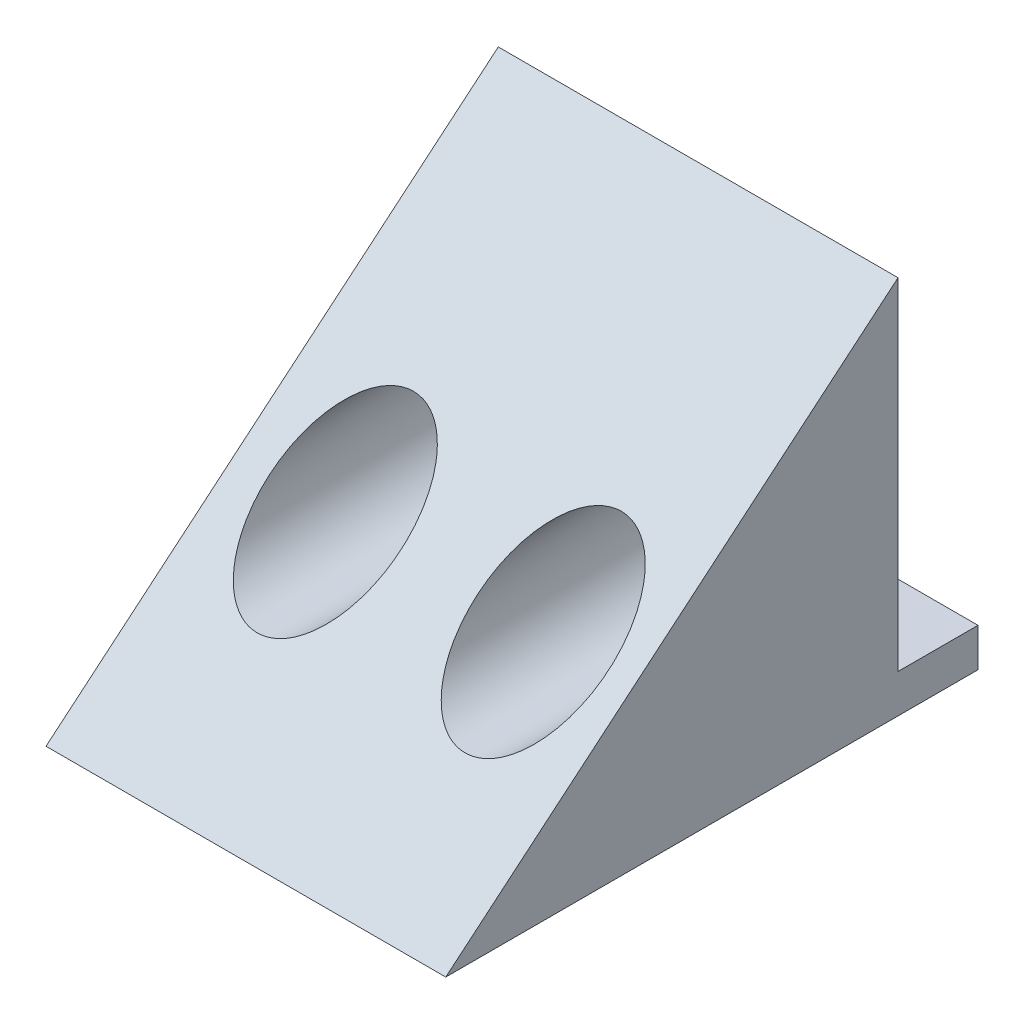
ISO-10303-21;
HEADER;
FILE_DESCRIPTION(('STEP AP214'),'2;1');
FILE_NAME('part.step','',(''),(''),'','','');
FILE_SCHEMA(('AUTOMOTIVE_DESIGN { 1 0 10303 214 1 1 1 1 }'));
ENDSEC;
DATA;
#1=APPLICATION_CONTEXT('core data for automotive mechanical design processes');
#2=APPLICATION_PROTOCOL_DEFINITION('international standard','automotive_design',2000,#1);
#3=PRODUCT_CONTEXT('',#1,'mechanical');
#4=PRODUCT('Part','Part','',(#3));
#5=PRODUCT_RELATED_PRODUCT_CATEGORY('part','',(#4));
#6=PRODUCT_DEFINITION_FORMATION('','',#4);
#7=PRODUCT_DEFINITION_CONTEXT('part definition',#1,'design');
#8=PRODUCT_DEFINITION('design','',#6,#7);
#9=PRODUCT_DEFINITION_SHAPE('','',#8);
#10=(LENGTH_UNIT() NAMED_UNIT(*) SI_UNIT(.MILLI.,.METRE.));
#11=(NAMED_UNIT(*) PLANE_ANGLE_UNIT() SI_UNIT($,.RADIAN.));
#12=(NAMED_UNIT(*) SI_UNIT($,.STERADIAN.) SOLID_ANGLE_UNIT());
#13=UNCERTAINTY_MEASURE_WITH_UNIT(LENGTH_MEASURE(1.E-05),#10,'distance_accuracy_value','');
#14=(GEOMETRIC_REPRESENTATION_CONTEXT(3) GLOBAL_UNCERTAINTY_ASSIGNED_CONTEXT((#13)) GLOBAL_UNIT_ASSIGNED_CONTEXT((#10,
#11,#12)) REPRESENTATION_CONTEXT('',''));
#15=CARTESIAN_POINT('',(0.,0.,0.));
#16=DIRECTION('',(0.,0.,1.));
#17=DIRECTION('',(1.,0.,0.));
#18=AXIS2_PLACEMENT_3D('',#15,#16,#17);
#19=CARTESIAN_POINT('',(50.,0.,-56.5672108573154));
#20=DIRECTION('',(0.,0.,1.));
#21=DIRECTION('',(1.,0.,0.));
#22=AXIS2_PLACEMENT_3D('',#19,#20,#21);
#23=PLANE('',#22);
#24=CARTESIAN_POINT('',(12.5544439751325,19.83,-56.5672108573154));
#25=DIRECTION('',(0.,0.,-1.));
#26=DIRECTION('',(-1.,0.,0.));
#27=AXIS2_PLACEMENT_3D('',#24,#25,#26);
#28=CIRCLE('',#27,8.2);
#29=CARTESIAN_POINT('',(4.35444397513247,19.83,-56.5672108573154));
#30=VERTEX_POINT('',#29);
#31=EDGE_CURVE('E104',#30,#30,#28,.T.);
#32=ORIENTED_EDGE('',*,*,#31,.F.);
#33=EDGE_LOOP('',(#32));
#34=FACE_BOUND('',#33,.T.);
#35=CARTESIAN_POINT('',(38.5544439751325,19.83,-56.5672108573154));
#36=DIRECTION('',(0.,0.,-1.));
#37=DIRECTION('',(-1.,0.,0.));
#38=AXIS2_PLACEMENT_3D('',#35,#36,#37);
#39=CIRCLE('',#38,8.2);
#40=CARTESIAN_POINT('',(30.3544439751325,19.83,-56.5672108573154));
#41=VERTEX_POINT('',#40);
#42=EDGE_CURVE('E103',#41,#41,#39,.T.);
#43=ORIENTED_EDGE('',*,*,#42,.F.);
#44=EDGE_LOOP('',(#43));
#45=FACE_BOUND('',#44,.T.);
#46=DIRECTION('',(1.,0.,0.));
#47=VECTOR('',#46,1.);
#48=CARTESIAN_POINT('',(50.,4.81865241578154,-56.5672108573154));
#49=LINE('',#48,#47);
#50=CARTESIAN_POINT('',(0.,4.81865241578154,-56.5672108573154));
#51=VERTEX_POINT('',#50);
#52=CARTESIAN_POINT('',(50.,4.81865241578154,-56.5672108573154));
#53=VERTEX_POINT('',#52);
#54=EDGE_CURVE('E54',#51,#53,#49,.T.);
#55=ORIENTED_EDGE('',*,*,#54,.F.);
#56=DIRECTION('',(0.,1.,0.));
#57=VECTOR('',#56,1.);
#58=CARTESIAN_POINT('',(0.,0.,-56.5672108573154));
#59=LINE('',#58,#57);
#60=CARTESIAN_POINT('',(0.,47.4655257671009,-56.5672108573154));
#61=VERTEX_POINT('',#60);
#62=EDGE_CURVE('E72',#51,#61,#59,.T.);
#63=ORIENTED_EDGE('',*,*,#62,.T.);
#64=DIRECTION('',(-1.,0.,0.));
#65=VECTOR('',#64,1.);
#66=CARTESIAN_POINT('',(50.,47.4655257671009,-56.5672108573154));
#67=LINE('',#66,#65);
#68=CARTESIAN_POINT('',(50.,47.4655257671009,-56.5672108573154));
#69=VERTEX_POINT('',#68);
#70=EDGE_CURVE('E47',#69,#61,#67,.T.);
#71=ORIENTED_EDGE('',*,*,#70,.F.);
#72=DIRECTION('',(0.,1.,0.));
#73=VECTOR('',#72,1.);
#74=CARTESIAN_POINT('',(50.,0.,-56.5672108573154));
#75=LINE('',#74,#73);
#76=EDGE_CURVE('E62',#53,#69,#75,.T.);
#77=ORIENTED_EDGE('',*,*,#76,.F.);
#78=EDGE_LOOP('',(#55,#63,#71,#77));
#79=FACE_BOUND('',#78,.T.);
#80=ADVANCED_FACE('F39',(#34,#45,#79),#23,.F.);
#81=CARTESIAN_POINT('',(50.,0.,0.));
#82=DIRECTION('',(0.,-0.766044443118977,-0.64278760968654));
#83=DIRECTION('',(0.,0.64278760968654,-0.766044443118977));
#84=AXIS2_PLACEMENT_3D('',#81,#82,#83);
#85=PLANE('',#84);
#86=CARTESIAN_POINT('',(38.5544439751325,19.83,-23.6324737411431));
#87=DIRECTION('',(0.,-0.766044443118977,-0.64278760968654));
#88=DIRECTION('',(0.,0.64278760968654,-0.766044443118977));
#89=AXIS2_PLACEMENT_3D('',#86,#87,#88);
#90=ELLIPSE('',#89,12.7569353802554,8.2);
#91=CARTESIAN_POINT('',(38.5544439751325,28.03,-33.4048532004156));
#92=VERTEX_POINT('',#91);
#93=EDGE_CURVE('E89',#92,#92,#90,.T.);
#94=ORIENTED_EDGE('',*,*,#93,.T.);
#95=EDGE_LOOP('',(#94));
#96=FACE_BOUND('',#95,.T.);
#97=CARTESIAN_POINT('',(12.5544439751325,19.83,-23.6324737411431));
#98=DIRECTION('',(0.,-0.766044443118977,-0.64278760968654));
#99=DIRECTION('',(0.,0.64278760968654,-0.766044443118977));
#100=AXIS2_PLACEMENT_3D('',#97,#98,#99);
#101=ELLIPSE('',#100,12.7569353802554,8.2);
#102=CARTESIAN_POINT('',(12.5544439751325,28.03,-33.4048532004156));
#103=VERTEX_POINT('',#102);
#104=EDGE_CURVE('E93',#103,#103,#101,.T.);
#105=ORIENTED_EDGE('',*,*,#104,.T.);
#106=EDGE_LOOP('',(#105));
#107=FACE_BOUND('',#106,.T.);
#108=DIRECTION('',(0.,-0.64278760968654,0.766044443118977));
#109=VECTOR('',#108,1.);
#110=CARTESIAN_POINT('',(0.,0.,0.));
#111=LINE('',#110,#109);
#112=CARTESIAN_POINT('',(0.,0.,0.));
#113=VERTEX_POINT('',#112);
#114=EDGE_CURVE('E85',#61,#113,#111,.T.);
#115=ORIENTED_EDGE('',*,*,#114,.T.);
#116=DIRECTION('',(-1.,0.,0.));
#117=VECTOR('',#116,1.);
#118=CARTESIAN_POINT('',(50.,0.,0.));
#119=LINE('',#118,#117);
#120=CARTESIAN_POINT('',(50.,0.,0.));
#121=VERTEX_POINT('',#120);
#122=EDGE_CURVE('E11',#121,#113,#119,.T.);
#123=ORIENTED_EDGE('',*,*,#122,.F.);
#124=DIRECTION('',(0.,-0.64278760968654,0.766044443118977));
#125=VECTOR('',#124,1.);
#126=CARTESIAN_POINT('',(50.,0.,0.));
#127=LINE('',#126,#125);
#128=EDGE_CURVE('E79',#69,#121,#127,.T.);
#129=ORIENTED_EDGE('',*,*,#128,.F.);
#130=ORIENTED_EDGE('',*,*,#70,.T.);
#131=EDGE_LOOP('',(#115,#123,#129,#130));
#132=FACE_BOUND('',#131,.T.);
#133=ADVANCED_FACE('F41',(#96,#107,#132),#85,.F.);
#134=CARTESIAN_POINT('',(50.,0.,0.));
#135=DIRECTION('',(0.,1.,0.));
#136=DIRECTION('',(0.,0.,1.));
#137=AXIS2_PLACEMENT_3D('',#134,#135,#136);
#138=PLANE('',#137);
#139=CARTESIAN_POINT('',(24.6819354769607,0.,-61.8784027442422));
#140=DIRECTION('',(0.,1.,0.));
#141=DIRECTION('',(0.,0.,1.));
#142=AXIS2_PLACEMENT_3D('',#139,#140,#141);
#143=CIRCLE('',#142,1.585);
#144=CARTESIAN_POINT('',(24.6819354769607,0.,-60.2934027442422));
#145=VERTEX_POINT('',#144);
#146=EDGE_CURVE('E116',#145,#145,#143,.T.);
#147=ORIENTED_EDGE('',*,*,#146,.T.);
#148=EDGE_LOOP('',(#147));
#149=FACE_BOUND('',#148,.T.);
#150=DIRECTION('',(0.,0.,-1.));
#151=VECTOR('',#150,1.);
#152=CARTESIAN_POINT('',(0.,0.,0.));
#153=LINE('',#152,#151);
#154=CARTESIAN_POINT('',(0.,0.,-66.5672108573154));
#155=VERTEX_POINT('',#154);
#156=EDGE_CURVE('E80',#113,#155,#153,.T.);
#157=ORIENTED_EDGE('',*,*,#156,.T.);
#158=DIRECTION('',(-1.,0.,0.));
#159=VECTOR('',#158,1.);
#160=CARTESIAN_POINT('',(50.,0.,-66.5672108573154));
#161=LINE('',#160,#159);
#162=CARTESIAN_POINT('',(50.,0.,-66.5672108573154));
#163=VERTEX_POINT('',#162);
#164=EDGE_CURVE('E122',#163,#155,#161,.T.);
#165=ORIENTED_EDGE('',*,*,#164,.F.);
#166=DIRECTION('',(0.,0.,-1.));
#167=VECTOR('',#166,1.);
#168=CARTESIAN_POINT('',(50.,0.,0.));
#169=LINE('',#168,#167);
#170=EDGE_CURVE('E97',#121,#163,#169,.T.);
#171=ORIENTED_EDGE('',*,*,#170,.F.);
#172=ORIENTED_EDGE('',*,*,#122,.T.);
#173=EDGE_LOOP('',(#157,#165,#171,#172));
#174=FACE_BOUND('',#173,.T.);
#175=ADVANCED_FACE('F157',(#149,#174),#138,.F.);
#176=CARTESIAN_POINT('',(50.,0.,0.));
#177=DIRECTION('',(1.,0.,0.));
#178=DIRECTION('',(0.,0.,-1.));
#179=AXIS2_PLACEMENT_3D('',#176,#177,#178);
#180=PLANE('',#179);
#181=ORIENTED_EDGE('',*,*,#128,.T.);
#182=ORIENTED_EDGE('',*,*,#170,.T.);
#183=DIRECTION('',(0.,-1.,0.));
#184=VECTOR('',#183,1.);
#185=CARTESIAN_POINT('',(50.,0.,-66.5672108573154));
#186=LINE('',#185,#184);
#187=CARTESIAN_POINT('',(50.,4.81865241578154,-66.5672108573154));
#188=VERTEX_POINT('',#187);
#189=EDGE_CURVE('E115',#188,#163,#186,.T.);
#190=ORIENTED_EDGE('',*,*,#189,.F.);
#191=DIRECTION('',(0.,0.,1.));
#192=VECTOR('',#191,1.);
#193=CARTESIAN_POINT('',(50.,4.81865241578154,-66.5672108573154));
#194=LINE('',#193,#192);
#195=EDGE_CURVE('E111',#188,#53,#194,.T.);
#196=ORIENTED_EDGE('',*,*,#195,.T.);
#197=ORIENTED_EDGE('',*,*,#76,.T.);
#198=EDGE_LOOP('',(#181,#182,#190,#196,#197));
#199=FACE_BOUND('',#198,.T.);
#200=ADVANCED_FACE('F147',(#199),#180,.T.);
#201=CARTESIAN_POINT('',(0.,0.,0.));
#202=DIRECTION('',(1.,0.,0.));
#203=DIRECTION('',(0.,0.,-1.));
#204=AXIS2_PLACEMENT_3D('',#201,#202,#203);
#205=PLANE('',#204);
#206=ORIENTED_EDGE('',*,*,#114,.F.);
#207=ORIENTED_EDGE('',*,*,#62,.F.);
#208=DIRECTION('',(0.,0.,1.));
#209=VECTOR('',#208,1.);
#210=CARTESIAN_POINT('',(0.,4.81865241578154,-66.5672108573154));
#211=LINE('',#210,#209);
#212=CARTESIAN_POINT('',(0.,4.81865241578154,-66.5672108573154));
#213=VERTEX_POINT('',#212);
#214=EDGE_CURVE('E107',#213,#51,#211,.T.);
#215=ORIENTED_EDGE('',*,*,#214,.F.);
#216=DIRECTION('',(0.,1.,0.));
#217=VECTOR('',#216,1.);
#218=CARTESIAN_POINT('',(0.,0.,-66.5672108573154));
#219=LINE('',#218,#217);
#220=EDGE_CURVE('E119',#155,#213,#219,.T.);
#221=ORIENTED_EDGE('',*,*,#220,.F.);
#222=ORIENTED_EDGE('',*,*,#156,.F.);
#223=EDGE_LOOP('',(#206,#207,#215,#221,#222));
#224=FACE_BOUND('',#223,.T.);
#225=ADVANCED_FACE('F86',(#224),#205,.F.);
#226=CARTESIAN_POINT('',(12.5544439751325,19.83,18.6027891426846));
#227=DIRECTION('',(0.,0.,-1.));
#228=DIRECTION('',(-1.,0.,0.));
#229=AXIS2_PLACEMENT_3D('',#226,#227,#228);
#230=CYLINDRICAL_SURFACE('',#229,8.2);
#231=ORIENTED_EDGE('',*,*,#31,.T.);
#232=EDGE_LOOP('',(#231));
#233=FACE_BOUND('',#232,.T.);
#234=ORIENTED_EDGE('',*,*,#104,.F.);
#235=EDGE_LOOP('',(#234));
#236=FACE_BOUND('',#235,.T.);
#237=ADVANCED_FACE('F175',(#233,#236),#230,.F.);
#238=CARTESIAN_POINT('',(38.5544439751325,19.83,18.6027891426846));
#239=DIRECTION('',(0.,0.,-1.));
#240=DIRECTION('',(-1.,0.,0.));
#241=AXIS2_PLACEMENT_3D('',#238,#239,#240);
#242=CYLINDRICAL_SURFACE('',#241,8.2);
#243=ORIENTED_EDGE('',*,*,#42,.T.);
#244=EDGE_LOOP('',(#243));
#245=FACE_BOUND('',#244,.T.);
#246=ORIENTED_EDGE('',*,*,#93,.F.);
#247=EDGE_LOOP('',(#246));
#248=FACE_BOUND('',#247,.T.);
#249=ADVANCED_FACE('F140',(#245,#248),#242,.F.);
#250=CARTESIAN_POINT('',(50.,4.81865241578154,-66.5672108573154));
#251=DIRECTION('',(0.,-1.,0.));
#252=DIRECTION('',(0.,0.,-1.));
#253=AXIS2_PLACEMENT_3D('',#250,#251,#252);
#254=PLANE('',#253);
#255=CARTESIAN_POINT('',(24.6819354769607,4.81865241578154,-61.8784027442422));
#256=DIRECTION('',(0.,1.,0.));
#257=DIRECTION('',(0.,0.,1.));
#258=AXIS2_PLACEMENT_3D('',#255,#256,#257);
#259=CIRCLE('',#258,1.585);
#260=CARTESIAN_POINT('',(24.6819354769607,4.81865241578154,-60.2934027442422));
#261=VERTEX_POINT('',#260);
#262=EDGE_CURVE('E129',#261,#261,#259,.T.);
#263=ORIENTED_EDGE('',*,*,#262,.F.);
#264=EDGE_LOOP('',(#263));
#265=FACE_BOUND('',#264,.T.);
#266=ORIENTED_EDGE('',*,*,#54,.T.);
#267=ORIENTED_EDGE('',*,*,#195,.F.);
#268=DIRECTION('',(1.,0.,0.));
#269=VECTOR('',#268,1.);
#270=CARTESIAN_POINT('',(50.,4.81865241578154,-66.5672108573154));
#271=LINE('',#270,#269);
#272=EDGE_CURVE('E113',#213,#188,#271,.T.);
#273=ORIENTED_EDGE('',*,*,#272,.F.);
#274=ORIENTED_EDGE('',*,*,#214,.T.);
#275=EDGE_LOOP('',(#266,#267,#273,#274));
#276=FACE_BOUND('',#275,.T.);
#277=ADVANCED_FACE('F136',(#265,#276),#254,.F.);
#278=CARTESIAN_POINT('',(0.,0.,-66.5672108573154));
#279=DIRECTION('',(0.,0.,1.));
#280=DIRECTION('',(1.,0.,0.));
#281=AXIS2_PLACEMENT_3D('',#278,#279,#280);
#282=PLANE('',#281);
#283=ORIENTED_EDGE('',*,*,#189,.T.);
#284=ORIENTED_EDGE('',*,*,#164,.T.);
#285=ORIENTED_EDGE('',*,*,#220,.T.);
#286=ORIENTED_EDGE('',*,*,#272,.T.);
#287=EDGE_LOOP('',(#283,#284,#285,#286));
#288=FACE_BOUND('',#287,.T.);
#289=ADVANCED_FACE('F139',(#288),#282,.F.);
#290=CARTESIAN_POINT('',(24.6819354769607,-5.18134758421846,-61.8784027442422));
#291=DIRECTION('',(0.,1.,0.));
#292=DIRECTION('',(0.,0.,1.));
#293=AXIS2_PLACEMENT_3D('',#290,#291,#292);
#294=CYLINDRICAL_SURFACE('',#293,1.585);
#295=ORIENTED_EDGE('',*,*,#262,.T.);
#296=EDGE_LOOP('',(#295));
#297=FACE_BOUND('',#296,.T.);
#298=ORIENTED_EDGE('',*,*,#146,.F.);
#299=EDGE_LOOP('',(#298));
#300=FACE_BOUND('',#299,.T.);
#301=ADVANCED_FACE('F133',(#297,#300),#294,.F.);
#302=CLOSED_SHELL('',(#80,#133,#175,#200,#225,#237,#249,#277,#289,#301));
#303=MANIFOLD_SOLID_BREP('B2',#302);
#304=ADVANCED_BREP_SHAPE_REPRESENTATION('',(#18,#303),#14);
#305=SHAPE_DEFINITION_REPRESENTATION(#9,#304);
ENDSEC;
END-ISO-10303-21;
